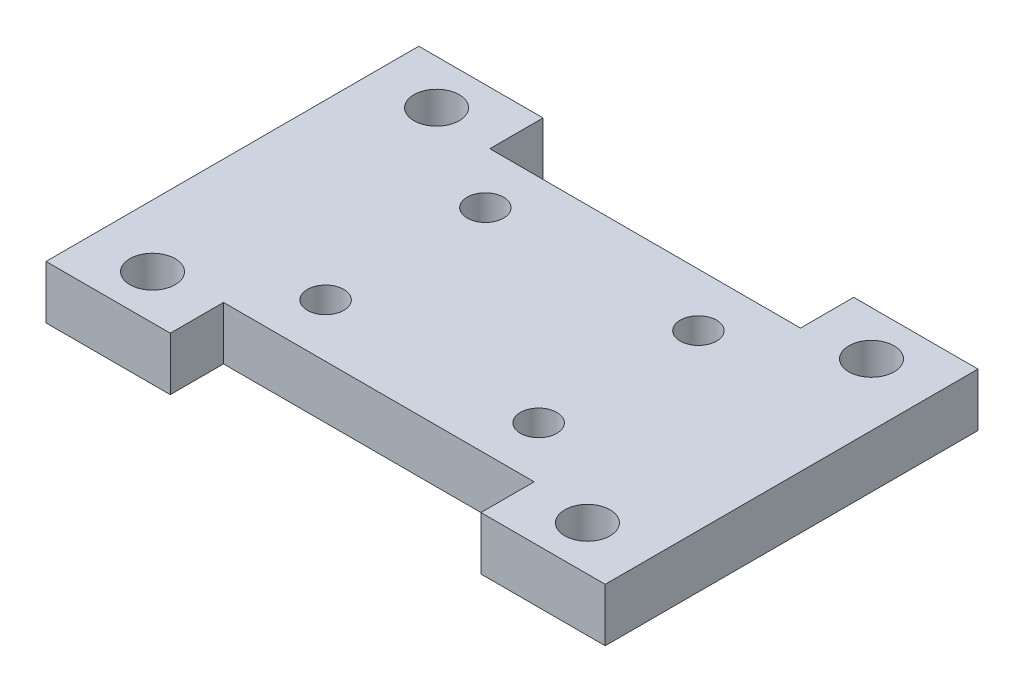
ISO-10303-21;
HEADER;
FILE_DESCRIPTION(('STEP AP214'),'2;1');
FILE_NAME('part.step','',(''),(''),'','','');
FILE_SCHEMA(('AUTOMOTIVE_DESIGN { 1 0 10303 214 1 1 1 1 }'));
ENDSEC;
DATA;
#1=APPLICATION_CONTEXT('core data for automotive mechanical design processes');
#2=APPLICATION_PROTOCOL_DEFINITION('international standard','automotive_design',2000,#1);
#3=PRODUCT_CONTEXT('',#1,'mechanical');
#4=PRODUCT('Part','Part','',(#3));
#5=PRODUCT_RELATED_PRODUCT_CATEGORY('part','',(#4));
#6=PRODUCT_DEFINITION_FORMATION('','',#4);
#7=PRODUCT_DEFINITION_CONTEXT('part definition',#1,'design');
#8=PRODUCT_DEFINITION('design','',#6,#7);
#9=PRODUCT_DEFINITION_SHAPE('','',#8);
#10=(LENGTH_UNIT() NAMED_UNIT(*) SI_UNIT(.MILLI.,.METRE.));
#11=(NAMED_UNIT(*) PLANE_ANGLE_UNIT() SI_UNIT($,.RADIAN.));
#12=(NAMED_UNIT(*) SI_UNIT($,.STERADIAN.) SOLID_ANGLE_UNIT());
#13=UNCERTAINTY_MEASURE_WITH_UNIT(LENGTH_MEASURE(1.E-05),#10,'distance_accuracy_value','');
#14=(GEOMETRIC_REPRESENTATION_CONTEXT(3) GLOBAL_UNCERTAINTY_ASSIGNED_CONTEXT((#13)) GLOBAL_UNIT_ASSIGNED_CONTEXT((#10,
#11,#12)) REPRESENTATION_CONTEXT('',''));
#15=CARTESIAN_POINT('',(0.,0.,0.));
#16=DIRECTION('',(0.,0.,1.));
#17=DIRECTION('',(1.,0.,0.));
#18=AXIS2_PLACEMENT_3D('',#15,#16,#17);
#19=CARTESIAN_POINT('',(0.,6.,0.));
#20=DIRECTION('',(0.,-1.,0.));
#21=DIRECTION('',(0.,0.,-1.));
#22=AXIS2_PLACEMENT_3D('',#19,#20,#21);
#23=PLANE('',#22);
#24=DIRECTION('',(0.,0.,1.));
#25=VECTOR('',#24,1.);
#26=CARTESIAN_POINT('',(17.5,6.,-15.));
#27=LINE('',#26,#25);
#28=CARTESIAN_POINT('',(17.5,6.,-21.));
#29=VERTEX_POINT('',#28);
#30=CARTESIAN_POINT('',(17.5,6.,-15.));
#31=VERTEX_POINT('',#30);
#32=EDGE_CURVE('E182',#29,#31,#27,.T.);
#33=ORIENTED_EDGE('',*,*,#32,.T.);
#34=DIRECTION('',(-1.,0.,0.));
#35=VECTOR('',#34,1.);
#36=CARTESIAN_POINT('',(-17.5,6.,-15.));
#37=LINE('',#36,#35);
#38=CARTESIAN_POINT('',(-17.5,6.,-15.));
#39=VERTEX_POINT('',#38);
#40=EDGE_CURVE('E110',#31,#39,#37,.T.);
#41=ORIENTED_EDGE('',*,*,#40,.T.);
#42=DIRECTION('',(0.,0.,-1.));
#43=VECTOR('',#42,1.);
#44=CARTESIAN_POINT('',(-17.5,6.,-15.));
#45=LINE('',#44,#43);
#46=CARTESIAN_POINT('',(-17.5,6.,-21.));
#47=VERTEX_POINT('',#46);
#48=EDGE_CURVE('E209',#39,#47,#45,.T.);
#49=ORIENTED_EDGE('',*,*,#48,.T.);
#50=DIRECTION('',(-1.,0.,0.));
#51=VECTOR('',#50,1.);
#52=CARTESIAN_POINT('',(-17.5,6.,-21.));
#53=LINE('',#52,#51);
#54=CARTESIAN_POINT('',(-31.5,6.,-21.));
#55=VERTEX_POINT('',#54);
#56=EDGE_CURVE('E228',#47,#55,#53,.T.);
#57=ORIENTED_EDGE('',*,*,#56,.T.);
#58=DIRECTION('',(0.,0.,1.));
#59=VECTOR('',#58,1.);
#60=CARTESIAN_POINT('',(-31.5,6.,-21.));
#61=LINE('',#60,#59);
#62=CARTESIAN_POINT('',(-31.5,6.,21.));
#63=VERTEX_POINT('',#62);
#64=EDGE_CURVE('E225',#55,#63,#61,.T.);
#65=ORIENTED_EDGE('',*,*,#64,.T.);
#66=DIRECTION('',(1.,0.,0.));
#67=VECTOR('',#66,1.);
#68=CARTESIAN_POINT('',(-31.5,6.,21.));
#69=LINE('',#68,#67);
#70=CARTESIAN_POINT('',(-17.5,6.,21.));
#71=VERTEX_POINT('',#70);
#72=EDGE_CURVE('E227',#63,#71,#69,.T.);
#73=ORIENTED_EDGE('',*,*,#72,.T.);
#74=DIRECTION('',(0.,0.,-1.));
#75=VECTOR('',#74,1.);
#76=CARTESIAN_POINT('',(-17.5,6.,21.));
#77=LINE('',#76,#75);
#78=CARTESIAN_POINT('',(-17.5,6.,15.));
#79=VERTEX_POINT('',#78);
#80=EDGE_CURVE('E230',#71,#79,#77,.T.);
#81=ORIENTED_EDGE('',*,*,#80,.T.);
#82=DIRECTION('',(1.,0.,0.));
#83=VECTOR('',#82,1.);
#84=CARTESIAN_POINT('',(-17.5,6.,15.));
#85=LINE('',#84,#83);
#86=CARTESIAN_POINT('',(17.5,6.,15.));
#87=VERTEX_POINT('',#86);
#88=EDGE_CURVE('E236',#79,#87,#85,.T.);
#89=ORIENTED_EDGE('',*,*,#88,.T.);
#90=DIRECTION('',(0.,0.,1.));
#91=VECTOR('',#90,1.);
#92=CARTESIAN_POINT('',(17.5,6.,21.));
#93=LINE('',#92,#91);
#94=CARTESIAN_POINT('',(17.5,6.,21.));
#95=VERTEX_POINT('',#94);
#96=EDGE_CURVE('E141',#87,#95,#93,.T.);
#97=ORIENTED_EDGE('',*,*,#96,.T.);
#98=DIRECTION('',(1.,0.,0.));
#99=VECTOR('',#98,1.);
#100=CARTESIAN_POINT('',(31.5,6.,21.));
#101=LINE('',#100,#99);
#102=CARTESIAN_POINT('',(31.5,6.,21.));
#103=VERTEX_POINT('',#102);
#104=EDGE_CURVE('E135',#95,#103,#101,.T.);
#105=ORIENTED_EDGE('',*,*,#104,.T.);
#106=DIRECTION('',(0.,0.,-1.));
#107=VECTOR('',#106,1.);
#108=CARTESIAN_POINT('',(31.5,6.,-21.));
#109=LINE('',#108,#107);
#110=CARTESIAN_POINT('',(31.5,6.,-21.));
#111=VERTEX_POINT('',#110);
#112=EDGE_CURVE('E139',#103,#111,#109,.T.);
#113=ORIENTED_EDGE('',*,*,#112,.T.);
#114=DIRECTION('',(-1.,0.,0.));
#115=VECTOR('',#114,1.);
#116=CARTESIAN_POINT('',(17.5,6.,-21.));
#117=LINE('',#116,#115);
#118=EDGE_CURVE('E55',#111,#29,#117,.T.);
#119=ORIENTED_EDGE('',*,*,#118,.T.);
#120=EDGE_LOOP('',(#33,#41,#49,#57,#65,#73,#81,#89,#97,#105,#113,#119));
#121=FACE_BOUND('',#120,.T.);
#122=CARTESIAN_POINT('',(-12.,6.,-9.));
#123=DIRECTION('',(0.,1.,0.));
#124=DIRECTION('',(0.,0.,1.));
#125=AXIS2_PLACEMENT_3D('',#122,#123,#124);
#126=CIRCLE('',#125,2.05);
#127=CARTESIAN_POINT('',(-12.,6.,-6.95));
#128=VERTEX_POINT('',#127);
#129=EDGE_CURVE('E163',#128,#128,#126,.T.);
#130=ORIENTED_EDGE('',*,*,#129,.F.);
#131=EDGE_LOOP('',(#130));
#132=FACE_BOUND('',#131,.T.);
#133=CARTESIAN_POINT('',(12.,6.,-9.));
#134=DIRECTION('',(0.,1.,0.));
#135=DIRECTION('',(0.,0.,-1.));
#136=AXIS2_PLACEMENT_3D('',#133,#134,#135);
#137=CIRCLE('',#136,2.05);
#138=CARTESIAN_POINT('',(12.,6.,-11.05));
#139=VERTEX_POINT('',#138);
#140=EDGE_CURVE('E340',#139,#139,#137,.T.);
#141=ORIENTED_EDGE('',*,*,#140,.F.);
#142=EDGE_LOOP('',(#141));
#143=FACE_BOUND('',#142,.T.);
#144=CARTESIAN_POINT('',(12.,6.,9.00000000000001));
#145=DIRECTION('',(0.,1.,0.));
#146=DIRECTION('',(0.,0.,1.));
#147=AXIS2_PLACEMENT_3D('',#144,#145,#146);
#148=CIRCLE('',#147,2.05);
#149=CARTESIAN_POINT('',(12.,6.,11.05));
#150=VERTEX_POINT('',#149);
#151=EDGE_CURVE('E334',#150,#150,#148,.T.);
#152=ORIENTED_EDGE('',*,*,#151,.F.);
#153=EDGE_LOOP('',(#152));
#154=FACE_BOUND('',#153,.T.);
#155=CARTESIAN_POINT('',(-12.,6.,9.));
#156=DIRECTION('',(0.,1.,0.));
#157=DIRECTION('',(0.,0.,-1.));
#158=AXIS2_PLACEMENT_3D('',#155,#156,#157);
#159=CIRCLE('',#158,2.05);
#160=CARTESIAN_POINT('',(-12.,6.,6.95));
#161=VERTEX_POINT('',#160);
#162=EDGE_CURVE('E328',#161,#161,#159,.T.);
#163=ORIENTED_EDGE('',*,*,#162,.F.);
#164=EDGE_LOOP('',(#163));
#165=FACE_BOUND('',#164,.T.);
#166=CARTESIAN_POINT('',(24.5,6.,-16.));
#167=DIRECTION('',(0.,1.,0.));
#168=DIRECTION('',(0.,0.,1.));
#169=AXIS2_PLACEMENT_3D('',#166,#167,#168);
#170=CIRCLE('',#169,2.55);
#171=CARTESIAN_POINT('',(24.5,6.,-13.45));
#172=VERTEX_POINT('',#171);
#173=EDGE_CURVE('E322',#172,#172,#170,.T.);
#174=ORIENTED_EDGE('',*,*,#173,.F.);
#175=EDGE_LOOP('',(#174));
#176=FACE_BOUND('',#175,.T.);
#177=CARTESIAN_POINT('',(24.5,6.,16.));
#178=DIRECTION('',(0.,1.,0.));
#179=DIRECTION('',(0.,0.,-1.));
#180=AXIS2_PLACEMENT_3D('',#177,#178,#179);
#181=CIRCLE('',#180,2.55);
#182=CARTESIAN_POINT('',(24.5,6.,13.45));
#183=VERTEX_POINT('',#182);
#184=EDGE_CURVE('E316',#183,#183,#181,.T.);
#185=ORIENTED_EDGE('',*,*,#184,.F.);
#186=EDGE_LOOP('',(#185));
#187=FACE_BOUND('',#186,.T.);
#188=CARTESIAN_POINT('',(-24.5,6.,16.));
#189=DIRECTION('',(0.,1.,0.));
#190=DIRECTION('',(0.,0.,1.));
#191=AXIS2_PLACEMENT_3D('',#188,#189,#190);
#192=CIRCLE('',#191,2.55);
#193=CARTESIAN_POINT('',(-24.5,6.,18.55));
#194=VERTEX_POINT('',#193);
#195=EDGE_CURVE('E310',#194,#194,#192,.T.);
#196=ORIENTED_EDGE('',*,*,#195,.F.);
#197=EDGE_LOOP('',(#196));
#198=FACE_BOUND('',#197,.T.);
#199=CARTESIAN_POINT('',(-24.5,6.,-16.));
#200=DIRECTION('',(0.,1.,0.));
#201=DIRECTION('',(0.,0.,-1.));
#202=AXIS2_PLACEMENT_3D('',#199,#200,#201);
#203=CIRCLE('',#202,2.55);
#204=CARTESIAN_POINT('',(-24.5,6.,-18.55));
#205=VERTEX_POINT('',#204);
#206=EDGE_CURVE('E301',#205,#205,#203,.T.);
#207=ORIENTED_EDGE('',*,*,#206,.F.);
#208=EDGE_LOOP('',(#207));
#209=FACE_BOUND('',#208,.T.);
#210=ADVANCED_FACE('F38',(#121,#132,#143,#154,#165,#176,#187,#198,#209),#23,.F.);
#211=CARTESIAN_POINT('',(0.,0.,0.));
#212=DIRECTION('',(0.,-1.,0.));
#213=DIRECTION('',(0.,0.,-1.));
#214=AXIS2_PLACEMENT_3D('',#211,#212,#213);
#215=PLANE('',#214);
#216=CARTESIAN_POINT('',(-24.5,0.,16.));
#217=DIRECTION('',(0.,1.,0.));
#218=DIRECTION('',(0.,0.,1.));
#219=AXIS2_PLACEMENT_3D('',#216,#217,#218);
#220=CIRCLE('',#219,2.55);
#221=CARTESIAN_POINT('',(-24.5,0.,18.55));
#222=VERTEX_POINT('',#221);
#223=EDGE_CURVE('E307',#222,#222,#220,.T.);
#224=ORIENTED_EDGE('',*,*,#223,.T.);
#225=EDGE_LOOP('',(#224));
#226=FACE_BOUND('',#225,.T.);
#227=CARTESIAN_POINT('',(24.5,0.,-16.));
#228=DIRECTION('',(0.,1.,0.));
#229=DIRECTION('',(0.,0.,1.));
#230=AXIS2_PLACEMENT_3D('',#227,#228,#229);
#231=CIRCLE('',#230,2.55);
#232=CARTESIAN_POINT('',(24.5,0.,-13.45));
#233=VERTEX_POINT('',#232);
#234=EDGE_CURVE('E319',#233,#233,#231,.T.);
#235=ORIENTED_EDGE('',*,*,#234,.T.);
#236=EDGE_LOOP('',(#235));
#237=FACE_BOUND('',#236,.T.);
#238=CARTESIAN_POINT('',(12.,0.,9.00000000000001));
#239=DIRECTION('',(0.,1.,0.));
#240=DIRECTION('',(0.,0.,1.));
#241=AXIS2_PLACEMENT_3D('',#238,#239,#240);
#242=CIRCLE('',#241,2.05);
#243=CARTESIAN_POINT('',(12.,0.,11.05));
#244=VERTEX_POINT('',#243);
#245=EDGE_CURVE('E331',#244,#244,#242,.T.);
#246=ORIENTED_EDGE('',*,*,#245,.T.);
#247=EDGE_LOOP('',(#246));
#248=FACE_BOUND('',#247,.T.);
#249=CARTESIAN_POINT('',(-12.,0.,-9.));
#250=DIRECTION('',(0.,1.,0.));
#251=DIRECTION('',(0.,0.,1.));
#252=AXIS2_PLACEMENT_3D('',#249,#250,#251);
#253=CIRCLE('',#252,2.05);
#254=CARTESIAN_POINT('',(-12.,0.,-6.95));
#255=VERTEX_POINT('',#254);
#256=EDGE_CURVE('E343',#255,#255,#253,.T.);
#257=ORIENTED_EDGE('',*,*,#256,.T.);
#258=EDGE_LOOP('',(#257));
#259=FACE_BOUND('',#258,.T.);
#260=DIRECTION('',(0.,0.,1.));
#261=VECTOR('',#260,1.);
#262=CARTESIAN_POINT('',(17.5,0.,-15.));
#263=LINE('',#262,#261);
#264=CARTESIAN_POINT('',(17.5,0.,-21.));
#265=VERTEX_POINT('',#264);
#266=CARTESIAN_POINT('',(17.5,0.,-15.));
#267=VERTEX_POINT('',#266);
#268=EDGE_CURVE('E159',#265,#267,#263,.T.);
#269=ORIENTED_EDGE('',*,*,#268,.F.);
#270=DIRECTION('',(-1.,0.,0.));
#271=VECTOR('',#270,1.);
#272=CARTESIAN_POINT('',(17.5,0.,-21.));
#273=LINE('',#272,#271);
#274=CARTESIAN_POINT('',(31.5,0.,-21.));
#275=VERTEX_POINT('',#274);
#276=EDGE_CURVE('E102',#275,#265,#273,.T.);
#277=ORIENTED_EDGE('',*,*,#276,.F.);
#278=DIRECTION('',(0.,0.,-1.));
#279=VECTOR('',#278,1.);
#280=CARTESIAN_POINT('',(31.5,0.,-21.));
#281=LINE('',#280,#279);
#282=CARTESIAN_POINT('',(31.5,0.,21.));
#283=VERTEX_POINT('',#282);
#284=EDGE_CURVE('E96',#283,#275,#281,.T.);
#285=ORIENTED_EDGE('',*,*,#284,.F.);
#286=DIRECTION('',(1.,0.,0.));
#287=VECTOR('',#286,1.);
#288=CARTESIAN_POINT('',(31.5,0.,21.));
#289=LINE('',#288,#287);
#290=CARTESIAN_POINT('',(17.5,0.,21.));
#291=VERTEX_POINT('',#290);
#292=EDGE_CURVE('E149',#291,#283,#289,.T.);
#293=ORIENTED_EDGE('',*,*,#292,.F.);
#294=DIRECTION('',(0.,0.,1.));
#295=VECTOR('',#294,1.);
#296=CARTESIAN_POINT('',(17.5,0.,21.));
#297=LINE('',#296,#295);
#298=CARTESIAN_POINT('',(17.5,0.,15.));
#299=VERTEX_POINT('',#298);
#300=EDGE_CURVE('E177',#299,#291,#297,.T.);
#301=ORIENTED_EDGE('',*,*,#300,.F.);
#302=DIRECTION('',(1.,0.,0.));
#303=VECTOR('',#302,1.);
#304=CARTESIAN_POINT('',(-17.5,0.,15.));
#305=LINE('',#304,#303);
#306=CARTESIAN_POINT('',(-17.5,0.,15.));
#307=VERTEX_POINT('',#306);
#308=EDGE_CURVE('E175',#307,#299,#305,.T.);
#309=ORIENTED_EDGE('',*,*,#308,.F.);
#310=DIRECTION('',(0.,0.,-1.));
#311=VECTOR('',#310,1.);
#312=CARTESIAN_POINT('',(-17.5,0.,21.));
#313=LINE('',#312,#311);
#314=CARTESIAN_POINT('',(-17.5,0.,21.));
#315=VERTEX_POINT('',#314);
#316=EDGE_CURVE('E173',#315,#307,#313,.T.);
#317=ORIENTED_EDGE('',*,*,#316,.F.);
#318=DIRECTION('',(1.,0.,0.));
#319=VECTOR('',#318,1.);
#320=CARTESIAN_POINT('',(-31.5,0.,21.));
#321=LINE('',#320,#319);
#322=CARTESIAN_POINT('',(-31.5,0.,21.));
#323=VERTEX_POINT('',#322);
#324=EDGE_CURVE('E171',#323,#315,#321,.T.);
#325=ORIENTED_EDGE('',*,*,#324,.F.);
#326=DIRECTION('',(0.,0.,1.));
#327=VECTOR('',#326,1.);
#328=CARTESIAN_POINT('',(-31.5,0.,-21.));
#329=LINE('',#328,#327);
#330=CARTESIAN_POINT('',(-31.5,0.,-21.));
#331=VERTEX_POINT('',#330);
#332=EDGE_CURVE('E169',#331,#323,#329,.T.);
#333=ORIENTED_EDGE('',*,*,#332,.F.);
#334=DIRECTION('',(-1.,0.,0.));
#335=VECTOR('',#334,1.);
#336=CARTESIAN_POINT('',(-17.5,0.,-21.));
#337=LINE('',#336,#335);
#338=CARTESIAN_POINT('',(-17.5,0.,-21.));
#339=VERTEX_POINT('',#338);
#340=EDGE_CURVE('E167',#339,#331,#337,.T.);
#341=ORIENTED_EDGE('',*,*,#340,.F.);
#342=DIRECTION('',(0.,0.,-1.));
#343=VECTOR('',#342,1.);
#344=CARTESIAN_POINT('',(-17.5,0.,-15.));
#345=LINE('',#344,#343);
#346=CARTESIAN_POINT('',(-17.5,0.,-15.));
#347=VERTEX_POINT('',#346);
#348=EDGE_CURVE('E165',#347,#339,#345,.T.);
#349=ORIENTED_EDGE('',*,*,#348,.F.);
#350=DIRECTION('',(-1.,0.,0.));
#351=VECTOR('',#350,1.);
#352=CARTESIAN_POINT('',(-17.5,0.,-15.));
#353=LINE('',#352,#351);
#354=EDGE_CURVE('E162',#267,#347,#353,.T.);
#355=ORIENTED_EDGE('',*,*,#354,.F.);
#356=EDGE_LOOP('',(#269,#277,#285,#293,#301,#309,#317,#325,#333,#341,#349,#355));
#357=FACE_BOUND('',#356,.T.);
#358=CARTESIAN_POINT('',(12.,0.,-9.));
#359=DIRECTION('',(0.,1.,0.));
#360=DIRECTION('',(0.,0.,-1.));
#361=AXIS2_PLACEMENT_3D('',#358,#359,#360);
#362=CIRCLE('',#361,2.05);
#363=CARTESIAN_POINT('',(12.,0.,-11.05));
#364=VERTEX_POINT('',#363);
#365=EDGE_CURVE('E337',#364,#364,#362,.T.);
#366=ORIENTED_EDGE('',*,*,#365,.T.);
#367=EDGE_LOOP('',(#366));
#368=FACE_BOUND('',#367,.T.);
#369=CARTESIAN_POINT('',(-12.,0.,9.));
#370=DIRECTION('',(0.,1.,0.));
#371=DIRECTION('',(0.,0.,-1.));
#372=AXIS2_PLACEMENT_3D('',#369,#370,#371);
#373=CIRCLE('',#372,2.05);
#374=CARTESIAN_POINT('',(-12.,0.,6.95));
#375=VERTEX_POINT('',#374);
#376=EDGE_CURVE('E325',#375,#375,#373,.T.);
#377=ORIENTED_EDGE('',*,*,#376,.T.);
#378=EDGE_LOOP('',(#377));
#379=FACE_BOUND('',#378,.T.);
#380=CARTESIAN_POINT('',(24.5,0.,16.));
#381=DIRECTION('',(0.,1.,0.));
#382=DIRECTION('',(0.,0.,-1.));
#383=AXIS2_PLACEMENT_3D('',#380,#381,#382);
#384=CIRCLE('',#383,2.55);
#385=CARTESIAN_POINT('',(24.5,0.,13.45));
#386=VERTEX_POINT('',#385);
#387=EDGE_CURVE('E313',#386,#386,#384,.T.);
#388=ORIENTED_EDGE('',*,*,#387,.T.);
#389=EDGE_LOOP('',(#388));
#390=FACE_BOUND('',#389,.T.);
#391=CARTESIAN_POINT('',(-24.5,0.,-16.));
#392=DIRECTION('',(0.,1.,0.));
#393=DIRECTION('',(0.,0.,-1.));
#394=AXIS2_PLACEMENT_3D('',#391,#392,#393);
#395=CIRCLE('',#394,2.55);
#396=CARTESIAN_POINT('',(-24.5,0.,-18.55));
#397=VERTEX_POINT('',#396);
#398=EDGE_CURVE('E304',#397,#397,#395,.T.);
#399=ORIENTED_EDGE('',*,*,#398,.T.);
#400=EDGE_LOOP('',(#399));
#401=FACE_BOUND('',#400,.T.);
#402=ADVANCED_FACE('F213',(#226,#237,#248,#259,#357,#368,#379,#390,#401),#215,.T.);
#403=CARTESIAN_POINT('',(17.5,6.,-15.));
#404=DIRECTION('',(1.,0.,0.));
#405=DIRECTION('',(0.,0.,-1.));
#406=AXIS2_PLACEMENT_3D('',#403,#404,#405);
#407=PLANE('',#406);
#408=ORIENTED_EDGE('',*,*,#268,.T.);
#409=DIRECTION('',(0.,-1.,0.));
#410=VECTOR('',#409,1.);
#411=CARTESIAN_POINT('',(17.5,6.,-15.));
#412=LINE('',#411,#410);
#413=EDGE_CURVE('E11',#31,#267,#412,.T.);
#414=ORIENTED_EDGE('',*,*,#413,.F.);
#415=ORIENTED_EDGE('',*,*,#32,.F.);
#416=DIRECTION('',(0.,-1.,0.));
#417=VECTOR('',#416,1.);
#418=CARTESIAN_POINT('',(17.5,6.,-21.));
#419=LINE('',#418,#417);
#420=EDGE_CURVE('E155',#29,#265,#419,.T.);
#421=ORIENTED_EDGE('',*,*,#420,.T.);
#422=EDGE_LOOP('',(#408,#414,#415,#421));
#423=FACE_BOUND('',#422,.T.);
#424=ADVANCED_FACE('F40',(#423),#407,.F.);
#425=CARTESIAN_POINT('',(-17.5,6.,-15.));
#426=DIRECTION('',(0.,0.,1.));
#427=DIRECTION('',(1.,0.,0.));
#428=AXIS2_PLACEMENT_3D('',#425,#426,#427);
#429=PLANE('',#428);
#430=ORIENTED_EDGE('',*,*,#354,.T.);
#431=DIRECTION('',(0.,-1.,0.));
#432=VECTOR('',#431,1.);
#433=CARTESIAN_POINT('',(-17.5,6.,-15.));
#434=LINE('',#433,#432);
#435=EDGE_CURVE('E47',#39,#347,#434,.T.);
#436=ORIENTED_EDGE('',*,*,#435,.F.);
#437=ORIENTED_EDGE('',*,*,#40,.F.);
#438=ORIENTED_EDGE('',*,*,#413,.T.);
#439=EDGE_LOOP('',(#430,#436,#437,#438));
#440=FACE_BOUND('',#439,.T.);
#441=ADVANCED_FACE('F499',(#440),#429,.F.);
#442=CARTESIAN_POINT('',(-17.5,6.,-15.));
#443=DIRECTION('',(-1.,0.,0.));
#444=DIRECTION('',(0.,0.,1.));
#445=AXIS2_PLACEMENT_3D('',#442,#443,#444);
#446=PLANE('',#445);
#447=ORIENTED_EDGE('',*,*,#348,.T.);
#448=DIRECTION('',(0.,-1.,0.));
#449=VECTOR('',#448,1.);
#450=CARTESIAN_POINT('',(-17.5,6.,-21.));
#451=LINE('',#450,#449);
#452=EDGE_CURVE('E201',#47,#339,#451,.T.);
#453=ORIENTED_EDGE('',*,*,#452,.F.);
#454=ORIENTED_EDGE('',*,*,#48,.F.);
#455=ORIENTED_EDGE('',*,*,#435,.T.);
#456=EDGE_LOOP('',(#447,#453,#454,#455));
#457=FACE_BOUND('',#456,.T.);
#458=ADVANCED_FACE('F207',(#457),#446,.F.);
#459=CARTESIAN_POINT('',(-17.5,6.,-21.));
#460=DIRECTION('',(0.,0.,1.));
#461=DIRECTION('',(1.,0.,0.));
#462=AXIS2_PLACEMENT_3D('',#459,#460,#461);
#463=PLANE('',#462);
#464=ORIENTED_EDGE('',*,*,#340,.T.);
#465=DIRECTION('',(0.,-1.,0.));
#466=VECTOR('',#465,1.);
#467=CARTESIAN_POINT('',(-31.5,6.,-21.));
#468=LINE('',#467,#466);
#469=EDGE_CURVE('E198',#55,#331,#468,.T.);
#470=ORIENTED_EDGE('',*,*,#469,.F.);
#471=ORIENTED_EDGE('',*,*,#56,.F.);
#472=ORIENTED_EDGE('',*,*,#452,.T.);
#473=EDGE_LOOP('',(#464,#470,#471,#472));
#474=FACE_BOUND('',#473,.T.);
#475=ADVANCED_FACE('F219',(#474),#463,.F.);
#476=CARTESIAN_POINT('',(-31.5,6.,-21.));
#477=DIRECTION('',(1.,0.,0.));
#478=DIRECTION('',(0.,0.,-1.));
#479=AXIS2_PLACEMENT_3D('',#476,#477,#478);
#480=PLANE('',#479);
#481=ORIENTED_EDGE('',*,*,#332,.T.);
#482=DIRECTION('',(0.,-1.,0.));
#483=VECTOR('',#482,1.);
#484=CARTESIAN_POINT('',(-31.5,6.,21.));
#485=LINE('',#484,#483);
#486=EDGE_CURVE('E195',#63,#323,#485,.T.);
#487=ORIENTED_EDGE('',*,*,#486,.F.);
#488=ORIENTED_EDGE('',*,*,#64,.F.);
#489=ORIENTED_EDGE('',*,*,#469,.T.);
#490=EDGE_LOOP('',(#481,#487,#488,#489));
#491=FACE_BOUND('',#490,.T.);
#492=ADVANCED_FACE('F223',(#491),#480,.F.);
#493=CARTESIAN_POINT('',(-31.5,6.,21.));
#494=DIRECTION('',(0.,0.,-1.));
#495=DIRECTION('',(-1.,0.,0.));
#496=AXIS2_PLACEMENT_3D('',#493,#494,#495);
#497=PLANE('',#496);
#498=ORIENTED_EDGE('',*,*,#324,.T.);
#499=DIRECTION('',(0.,-1.,0.));
#500=VECTOR('',#499,1.);
#501=CARTESIAN_POINT('',(-17.5,6.,21.));
#502=LINE('',#501,#500);
#503=EDGE_CURVE('E192',#71,#315,#502,.T.);
#504=ORIENTED_EDGE('',*,*,#503,.F.);
#505=ORIENTED_EDGE('',*,*,#72,.F.);
#506=ORIENTED_EDGE('',*,*,#486,.T.);
#507=EDGE_LOOP('',(#498,#504,#505,#506));
#508=FACE_BOUND('',#507,.T.);
#509=ADVANCED_FACE('F464',(#508),#497,.F.);
#510=CARTESIAN_POINT('',(-17.5,6.,21.));
#511=DIRECTION('',(-1.,0.,0.));
#512=DIRECTION('',(0.,0.,1.));
#513=AXIS2_PLACEMENT_3D('',#510,#511,#512);
#514=PLANE('',#513);
#515=ORIENTED_EDGE('',*,*,#316,.T.);
#516=DIRECTION('',(0.,-1.,0.));
#517=VECTOR('',#516,1.);
#518=CARTESIAN_POINT('',(-17.5,6.,15.));
#519=LINE('',#518,#517);
#520=EDGE_CURVE('E189',#79,#307,#519,.T.);
#521=ORIENTED_EDGE('',*,*,#520,.F.);
#522=ORIENTED_EDGE('',*,*,#80,.F.);
#523=ORIENTED_EDGE('',*,*,#503,.T.);
#524=EDGE_LOOP('',(#515,#521,#522,#523));
#525=FACE_BOUND('',#524,.T.);
#526=ADVANCED_FACE('F455',(#525),#514,.F.);
#527=CARTESIAN_POINT('',(-17.5,6.,15.));
#528=DIRECTION('',(0.,0.,-1.));
#529=DIRECTION('',(-1.,0.,0.));
#530=AXIS2_PLACEMENT_3D('',#527,#528,#529);
#531=PLANE('',#530);
#532=ORIENTED_EDGE('',*,*,#308,.T.);
#533=DIRECTION('',(0.,-1.,0.));
#534=VECTOR('',#533,1.);
#535=CARTESIAN_POINT('',(17.5,6.,15.));
#536=LINE('',#535,#534);
#537=EDGE_CURVE('E186',#87,#299,#536,.T.);
#538=ORIENTED_EDGE('',*,*,#537,.F.);
#539=ORIENTED_EDGE('',*,*,#88,.F.);
#540=ORIENTED_EDGE('',*,*,#520,.T.);
#541=EDGE_LOOP('',(#532,#538,#539,#540));
#542=FACE_BOUND('',#541,.T.);
#543=ADVANCED_FACE('F242',(#542),#531,.F.);
#544=CARTESIAN_POINT('',(17.5,6.,21.));
#545=DIRECTION('',(1.,0.,0.));
#546=DIRECTION('',(0.,0.,-1.));
#547=AXIS2_PLACEMENT_3D('',#544,#545,#546);
#548=PLANE('',#547);
#549=ORIENTED_EDGE('',*,*,#300,.T.);
#550=DIRECTION('',(0.,-1.,0.));
#551=VECTOR('',#550,1.);
#552=CARTESIAN_POINT('',(17.5,6.,21.));
#553=LINE('',#552,#551);
#554=EDGE_CURVE('E150',#95,#291,#553,.T.);
#555=ORIENTED_EDGE('',*,*,#554,.F.);
#556=ORIENTED_EDGE('',*,*,#96,.F.);
#557=ORIENTED_EDGE('',*,*,#537,.T.);
#558=EDGE_LOOP('',(#549,#555,#556,#557));
#559=FACE_BOUND('',#558,.T.);
#560=ADVANCED_FACE('F246',(#559),#548,.F.);
#561=CARTESIAN_POINT('',(31.5,6.,21.));
#562=DIRECTION('',(0.,0.,-1.));
#563=DIRECTION('',(-1.,0.,0.));
#564=AXIS2_PLACEMENT_3D('',#561,#562,#563);
#565=PLANE('',#564);
#566=ORIENTED_EDGE('',*,*,#292,.T.);
#567=DIRECTION('',(0.,-1.,0.));
#568=VECTOR('',#567,1.);
#569=CARTESIAN_POINT('',(31.5,6.,21.));
#570=LINE('',#569,#568);
#571=EDGE_CURVE('E146',#103,#283,#570,.T.);
#572=ORIENTED_EDGE('',*,*,#571,.F.);
#573=ORIENTED_EDGE('',*,*,#104,.F.);
#574=ORIENTED_EDGE('',*,*,#554,.T.);
#575=EDGE_LOOP('',(#566,#572,#573,#574));
#576=FACE_BOUND('',#575,.T.);
#577=ADVANCED_FACE('F147',(#576),#565,.F.);
#578=CARTESIAN_POINT('',(31.5,6.,-21.));
#579=DIRECTION('',(-1.,0.,0.));
#580=DIRECTION('',(0.,0.,1.));
#581=AXIS2_PLACEMENT_3D('',#578,#579,#580);
#582=PLANE('',#581);
#583=ORIENTED_EDGE('',*,*,#284,.T.);
#584=DIRECTION('',(0.,-1.,0.));
#585=VECTOR('',#584,1.);
#586=CARTESIAN_POINT('',(31.5,6.,-21.));
#587=LINE('',#586,#585);
#588=EDGE_CURVE('E151',#111,#275,#587,.T.);
#589=ORIENTED_EDGE('',*,*,#588,.F.);
#590=ORIENTED_EDGE('',*,*,#112,.F.);
#591=ORIENTED_EDGE('',*,*,#571,.T.);
#592=EDGE_LOOP('',(#583,#589,#590,#591));
#593=FACE_BOUND('',#592,.T.);
#594=ADVANCED_FACE('F153',(#593),#582,.F.);
#595=CARTESIAN_POINT('',(17.5,6.,-21.));
#596=DIRECTION('',(0.,0.,1.));
#597=DIRECTION('',(1.,0.,0.));
#598=AXIS2_PLACEMENT_3D('',#595,#596,#597);
#599=PLANE('',#598);
#600=ORIENTED_EDGE('',*,*,#276,.T.);
#601=ORIENTED_EDGE('',*,*,#420,.F.);
#602=ORIENTED_EDGE('',*,*,#118,.F.);
#603=ORIENTED_EDGE('',*,*,#588,.T.);
#604=EDGE_LOOP('',(#600,#601,#602,#603));
#605=FACE_BOUND('',#604,.T.);
#606=ADVANCED_FACE('F250',(#605),#599,.F.);
#607=CARTESIAN_POINT('',(-12.,6.,-9.));
#608=DIRECTION('',(0.,-1.,0.));
#609=DIRECTION('',(0.,0.,-1.));
#610=AXIS2_PLACEMENT_3D('',#607,#608,#609);
#611=CYLINDRICAL_SURFACE('',#610,2.05);
#612=ORIENTED_EDGE('',*,*,#129,.T.);
#613=EDGE_LOOP('',(#612));
#614=FACE_BOUND('',#613,.T.);
#615=ORIENTED_EDGE('',*,*,#256,.F.);
#616=EDGE_LOOP('',(#615));
#617=FACE_BOUND('',#616,.T.);
#618=ADVANCED_FACE('F252',(#614,#617),#611,.F.);
#619=CARTESIAN_POINT('',(12.,6.,-9.));
#620=DIRECTION('',(0.,-1.,0.));
#621=DIRECTION('',(0.,0.,-1.));
#622=AXIS2_PLACEMENT_3D('',#619,#620,#621);
#623=CYLINDRICAL_SURFACE('',#622,2.05);
#624=ORIENTED_EDGE('',*,*,#140,.T.);
#625=EDGE_LOOP('',(#624));
#626=FACE_BOUND('',#625,.T.);
#627=ORIENTED_EDGE('',*,*,#365,.F.);
#628=EDGE_LOOP('',(#627));
#629=FACE_BOUND('',#628,.T.);
#630=ADVANCED_FACE('F258',(#626,#629),#623,.F.);
#631=CARTESIAN_POINT('',(12.,6.,9.00000000000001));
#632=DIRECTION('',(0.,-1.,0.));
#633=DIRECTION('',(0.,0.,-1.));
#634=AXIS2_PLACEMENT_3D('',#631,#632,#633);
#635=CYLINDRICAL_SURFACE('',#634,2.05);
#636=ORIENTED_EDGE('',*,*,#151,.T.);
#637=EDGE_LOOP('',(#636));
#638=FACE_BOUND('',#637,.T.);
#639=ORIENTED_EDGE('',*,*,#245,.F.);
#640=EDGE_LOOP('',(#639));
#641=FACE_BOUND('',#640,.T.);
#642=ADVANCED_FACE('F272',(#638,#641),#635,.F.);
#643=CARTESIAN_POINT('',(-12.,6.,9.));
#644=DIRECTION('',(0.,-1.,0.));
#645=DIRECTION('',(0.,0.,-1.));
#646=AXIS2_PLACEMENT_3D('',#643,#644,#645);
#647=CYLINDRICAL_SURFACE('',#646,2.05);
#648=ORIENTED_EDGE('',*,*,#162,.T.);
#649=EDGE_LOOP('',(#648));
#650=FACE_BOUND('',#649,.T.);
#651=ORIENTED_EDGE('',*,*,#376,.F.);
#652=EDGE_LOOP('',(#651));
#653=FACE_BOUND('',#652,.T.);
#654=ADVANCED_FACE('F276',(#650,#653),#647,.F.);
#655=CARTESIAN_POINT('',(24.5,6.,-16.));
#656=DIRECTION('',(0.,-1.,0.));
#657=DIRECTION('',(0.,0.,-1.));
#658=AXIS2_PLACEMENT_3D('',#655,#656,#657);
#659=CYLINDRICAL_SURFACE('',#658,2.55);
#660=ORIENTED_EDGE('',*,*,#173,.T.);
#661=EDGE_LOOP('',(#660));
#662=FACE_BOUND('',#661,.T.);
#663=ORIENTED_EDGE('',*,*,#234,.F.);
#664=EDGE_LOOP('',(#663));
#665=FACE_BOUND('',#664,.T.);
#666=ADVANCED_FACE('F280',(#662,#665),#659,.F.);
#667=CARTESIAN_POINT('',(24.5,6.,16.));
#668=DIRECTION('',(0.,-1.,0.));
#669=DIRECTION('',(0.,0.,-1.));
#670=AXIS2_PLACEMENT_3D('',#667,#668,#669);
#671=CYLINDRICAL_SURFACE('',#670,2.55);
#672=ORIENTED_EDGE('',*,*,#184,.T.);
#673=EDGE_LOOP('',(#672));
#674=FACE_BOUND('',#673,.T.);
#675=ORIENTED_EDGE('',*,*,#387,.F.);
#676=EDGE_LOOP('',(#675));
#677=FACE_BOUND('',#676,.T.);
#678=ADVANCED_FACE('F284',(#674,#677),#671,.F.);
#679=CARTESIAN_POINT('',(-24.5,6.,16.));
#680=DIRECTION('',(0.,-1.,0.));
#681=DIRECTION('',(0.,0.,-1.));
#682=AXIS2_PLACEMENT_3D('',#679,#680,#681);
#683=CYLINDRICAL_SURFACE('',#682,2.55);
#684=ORIENTED_EDGE('',*,*,#195,.T.);
#685=EDGE_LOOP('',(#684));
#686=FACE_BOUND('',#685,.T.);
#687=ORIENTED_EDGE('',*,*,#223,.F.);
#688=EDGE_LOOP('',(#687));
#689=FACE_BOUND('',#688,.T.);
#690=ADVANCED_FACE('F288',(#686,#689),#683,.F.);
#691=CARTESIAN_POINT('',(-24.5,6.,-16.));
#692=DIRECTION('',(0.,-1.,0.));
#693=DIRECTION('',(0.,0.,-1.));
#694=AXIS2_PLACEMENT_3D('',#691,#692,#693);
#695=CYLINDRICAL_SURFACE('',#694,2.55);
#696=ORIENTED_EDGE('',*,*,#206,.T.);
#697=EDGE_LOOP('',(#696));
#698=FACE_BOUND('',#697,.T.);
#699=ORIENTED_EDGE('',*,*,#398,.F.);
#700=EDGE_LOOP('',(#699));
#701=FACE_BOUND('',#700,.T.);
#702=ADVANCED_FACE('F292',(#698,#701),#695,.F.);
#703=CLOSED_SHELL('',(#210,#402,#424,#441,#458,#475,#492,#509,#526,#543,#560,#577,#594,#606,
#618,#630,#642,#654,#666,#678,#690,#702));
#704=MANIFOLD_SOLID_BREP('B2',#703);
#705=ADVANCED_BREP_SHAPE_REPRESENTATION('',(#18,#704),#14);
#706=SHAPE_DEFINITION_REPRESENTATION(#9,#705);
ENDSEC;
END-ISO-10303-21;
